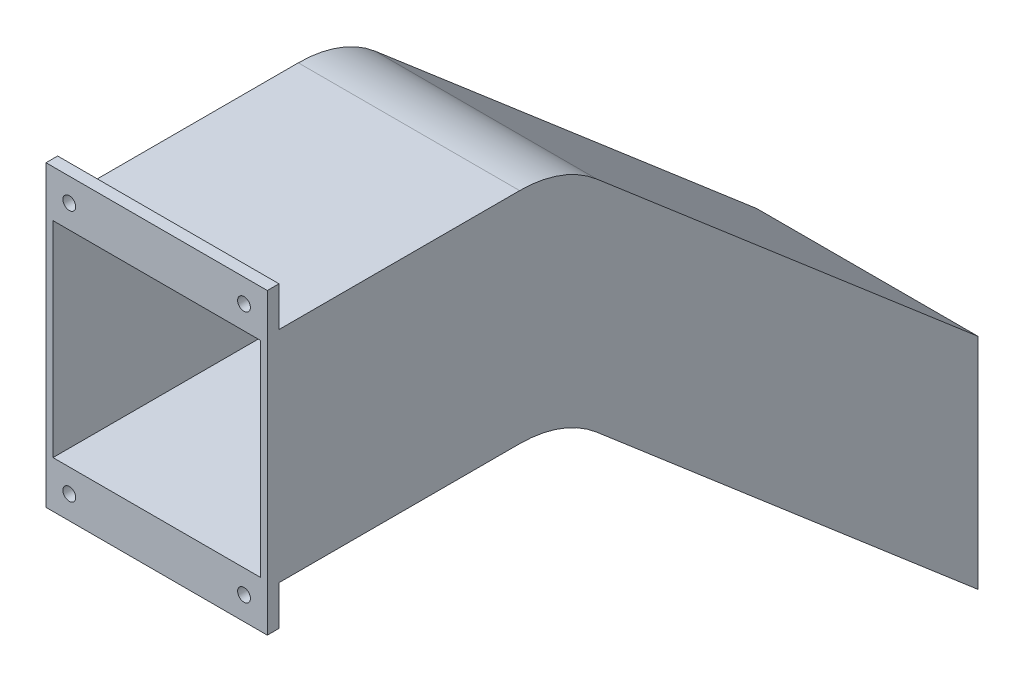
ISO-10303-21;
HEADER;
FILE_DESCRIPTION(('STEP AP214'),'2;1');
FILE_NAME('part.step','',(''),(''),'','','');
FILE_SCHEMA(('AUTOMOTIVE_DESIGN { 1 0 10303 214 1 1 1 1 }'));
ENDSEC;
DATA;
#1=APPLICATION_CONTEXT('core data for automotive mechanical design processes');
#2=APPLICATION_PROTOCOL_DEFINITION('international standard','automotive_design',2000,#1);
#3=PRODUCT_CONTEXT('',#1,'mechanical');
#4=PRODUCT('Part','Part','',(#3));
#5=PRODUCT_RELATED_PRODUCT_CATEGORY('part','',(#4));
#6=PRODUCT_DEFINITION_FORMATION('','',#4);
#7=PRODUCT_DEFINITION_CONTEXT('part definition',#1,'design');
#8=PRODUCT_DEFINITION('design','',#6,#7);
#9=PRODUCT_DEFINITION_SHAPE('','',#8);
#10=(LENGTH_UNIT() NAMED_UNIT(*) SI_UNIT(.MILLI.,.METRE.));
#11=(NAMED_UNIT(*) PLANE_ANGLE_UNIT() SI_UNIT($,.RADIAN.));
#12=(NAMED_UNIT(*) SI_UNIT($,.STERADIAN.) SOLID_ANGLE_UNIT());
#13=UNCERTAINTY_MEASURE_WITH_UNIT(LENGTH_MEASURE(1.E-05),#10,'distance_accuracy_value','');
#14=(GEOMETRIC_REPRESENTATION_CONTEXT(3) GLOBAL_UNCERTAINTY_ASSIGNED_CONTEXT((#13)) GLOBAL_UNIT_ASSIGNED_CONTEXT((#10,
#11,#12)) REPRESENTATION_CONTEXT('',''));
#15=CARTESIAN_POINT('',(0.,0.,0.));
#16=DIRECTION('',(0.,0.,1.));
#17=DIRECTION('',(1.,0.,0.));
#18=AXIS2_PLACEMENT_3D('',#15,#16,#17);
#19=CARTESIAN_POINT('',(-47.4625,47.012499986,127.));
#20=DIRECTION('',(0.,-1.,0.));
#21=DIRECTION('',(0.,0.,-1.));
#22=AXIS2_PLACEMENT_3D('',#19,#20,#21);
#23=PLANE('',#22);
#24=DIRECTION('',(-1.,0.,0.));
#25=VECTOR('',#24,1.);
#26=CARTESIAN_POINT('',(-47.4625,47.012499986,122.));
#27=LINE('',#26,#25);
#28=CARTESIAN_POINT('',(47.4625,47.012499986,122.));
#29=VERTEX_POINT('',#28);
#30=CARTESIAN_POINT('',(-47.4625,47.012499986,122.));
#31=VERTEX_POINT('',#30);
#32=EDGE_CURVE('E213',#29,#31,#27,.T.);
#33=ORIENTED_EDGE('',*,*,#32,.F.);
#34=DIRECTION('',(0.,0.,-1.));
#35=VECTOR('',#34,1.);
#36=CARTESIAN_POINT('',(47.4625,47.012499986,127.));
#37=LINE('',#36,#35);
#38=CARTESIAN_POINT('',(47.4625,47.012499986,18.7921430717464));
#39=VERTEX_POINT('',#38);
#40=EDGE_CURVE('E345',#29,#39,#37,.T.);
#41=ORIENTED_EDGE('',*,*,#40,.T.);
#42=DIRECTION('',(-1.,0.,0.));
#43=VECTOR('',#42,1.);
#44=CARTESIAN_POINT('',(-47.4625,47.012499986,18.7921430717464));
#45=LINE('',#44,#43);
#46=CARTESIAN_POINT('',(-47.4625,47.012499986,18.7921430717464));
#47=VERTEX_POINT('',#46);
#48=EDGE_CURVE('E347',#39,#47,#45,.T.);
#49=ORIENTED_EDGE('',*,*,#48,.T.);
#50=DIRECTION('',(0.,0.,-1.));
#51=VECTOR('',#50,1.);
#52=CARTESIAN_POINT('',(-47.4625,47.012499986,127.));
#53=LINE('',#52,#51);
#54=EDGE_CURVE('E343',#31,#47,#53,.T.);
#55=ORIENTED_EDGE('',*,*,#54,.F.);
#56=EDGE_LOOP('',(#33,#41,#49,#55));
#57=FACE_BOUND('',#56,.T.);
#58=ADVANCED_FACE('F39',(#57),#23,.F.);
#59=CARTESIAN_POINT('',(-47.4625,-47.012499986,127.));
#60=DIRECTION('',(0.,1.,0.));
#61=DIRECTION('',(0.,0.,1.));
#62=AXIS2_PLACEMENT_3D('',#59,#60,#61);
#63=PLANE('',#62);
#64=DIRECTION('',(1.,0.,0.));
#65=VECTOR('',#64,1.);
#66=CARTESIAN_POINT('',(-47.4625,-47.012499986,122.));
#67=LINE('',#66,#65);
#68=CARTESIAN_POINT('',(-47.4625,-47.012499986,122.));
#69=VERTEX_POINT('',#68);
#70=CARTESIAN_POINT('',(47.4625,-47.012499986,122.));
#71=VERTEX_POINT('',#70);
#72=EDGE_CURVE('E227',#69,#71,#67,.T.);
#73=ORIENTED_EDGE('',*,*,#72,.F.);
#74=DIRECTION('',(0.,0.,-1.));
#75=VECTOR('',#74,1.);
#76=CARTESIAN_POINT('',(-47.4625,-47.012499986,127.));
#77=LINE('',#76,#75);
#78=CARTESIAN_POINT('',(-47.4625,-47.012499986,18.7921430717464));
#79=VERTEX_POINT('',#78);
#80=EDGE_CURVE('E340',#69,#79,#77,.T.);
#81=ORIENTED_EDGE('',*,*,#80,.T.);
#82=DIRECTION('',(1.,0.,0.));
#83=VECTOR('',#82,1.);
#84=CARTESIAN_POINT('',(-47.4625,-47.012499986,18.7921430717464));
#85=LINE('',#84,#83);
#86=CARTESIAN_POINT('',(47.4625,-47.012499986,18.7921430717464));
#87=VERTEX_POINT('',#86);
#88=EDGE_CURVE('E357',#79,#87,#85,.T.);
#89=ORIENTED_EDGE('',*,*,#88,.T.);
#90=DIRECTION('',(0.,0.,-1.));
#91=VECTOR('',#90,1.);
#92=CARTESIAN_POINT('',(47.4625,-47.012499986,127.));
#93=LINE('',#92,#91);
#94=EDGE_CURVE('E198',#71,#87,#93,.T.);
#95=ORIENTED_EDGE('',*,*,#94,.F.);
#96=EDGE_LOOP('',(#73,#81,#89,#95));
#97=FACE_BOUND('',#96,.T.);
#98=ADVANCED_FACE('F417',(#97),#63,.F.);
#99=CARTESIAN_POINT('',(0.,0.,127.));
#100=DIRECTION('',(0.,0.,-1.));
#101=DIRECTION('',(-1.,0.,0.));
#102=AXIS2_PLACEMENT_3D('',#99,#100,#101);
#103=PLANE('',#102);
#104=CARTESIAN_POINT('',(37.4625,54.012499864,127.));
#105=DIRECTION('',(0.,0.,-1.));
#106=DIRECTION('',(-1.,0.,0.));
#107=AXIS2_PLACEMENT_3D('',#104,#105,#106);
#108=CIRCLE('',#107,2.75);
#109=CARTESIAN_POINT('',(34.7125,54.012499864,127.));
#110=VERTEX_POINT('',#109);
#111=EDGE_CURVE('E448',#110,#110,#108,.F.);
#112=ORIENTED_EDGE('',*,*,#111,.F.);
#113=EDGE_LOOP('',(#112));
#114=FACE_BOUND('',#113,.T.);
#115=CARTESIAN_POINT('',(-37.4625,-54.012499864,127.));
#116=DIRECTION('',(0.,0.,-1.));
#117=DIRECTION('',(-1.,0.,0.));
#118=AXIS2_PLACEMENT_3D('',#115,#116,#117);
#119=CIRCLE('',#118,2.75);
#120=CARTESIAN_POINT('',(-40.2125,-54.012499864,127.));
#121=VERTEX_POINT('',#120);
#122=EDGE_CURVE('E452',#121,#121,#119,.F.);
#123=ORIENTED_EDGE('',*,*,#122,.F.);
#124=EDGE_LOOP('',(#123));
#125=FACE_BOUND('',#124,.T.);
#126=CARTESIAN_POINT('',(37.4625,-54.012499864,127.));
#127=DIRECTION('',(0.,0.,-1.));
#128=DIRECTION('',(-1.,0.,0.));
#129=AXIS2_PLACEMENT_3D('',#126,#127,#128);
#130=CIRCLE('',#129,2.75);
#131=CARTESIAN_POINT('',(34.7125,-54.012499864,127.));
#132=VERTEX_POINT('',#131);
#133=EDGE_CURVE('E456',#132,#132,#130,.F.);
#134=ORIENTED_EDGE('',*,*,#133,.F.);
#135=EDGE_LOOP('',(#134));
#136=FACE_BOUND('',#135,.T.);
#137=CARTESIAN_POINT('',(-37.4625,54.012499864,127.));
#138=DIRECTION('',(0.,0.,-1.));
#139=DIRECTION('',(-1.,0.,0.));
#140=AXIS2_PLACEMENT_3D('',#137,#138,#139);
#141=CIRCLE('',#140,2.75);
#142=CARTESIAN_POINT('',(-40.2125,54.012499864,127.));
#143=VERTEX_POINT('',#142);
#144=EDGE_CURVE('E216',#143,#143,#141,.F.);
#145=ORIENTED_EDGE('',*,*,#144,.F.);
#146=EDGE_LOOP('',(#145));
#147=FACE_BOUND('',#146,.T.);
#148=DIRECTION('',(0.,1.,0.));
#149=VECTOR('',#148,1.);
#150=CARTESIAN_POINT('',(47.4625,-47.012499986,127.));
#151=LINE('',#150,#149);
#152=CARTESIAN_POINT('',(47.4625,-64.012499864,127.));
#153=VERTEX_POINT('',#152);
#154=CARTESIAN_POINT('',(47.4625,64.012499864,127.));
#155=VERTEX_POINT('',#154);
#156=EDGE_CURVE('E199',#153,#155,#151,.T.);
#157=ORIENTED_EDGE('',*,*,#156,.T.);
#158=DIRECTION('',(1.,0.,0.));
#159=VECTOR('',#158,1.);
#160=CARTESIAN_POINT('',(-47.4625,64.012499864,127.));
#161=LINE('',#160,#159);
#162=CARTESIAN_POINT('',(-47.4625,64.012499864,127.));
#163=VERTEX_POINT('',#162);
#164=EDGE_CURVE('E202',#163,#155,#161,.T.);
#165=ORIENTED_EDGE('',*,*,#164,.F.);
#166=DIRECTION('',(0.,-1.,0.));
#167=VECTOR('',#166,1.);
#168=CARTESIAN_POINT('',(-47.4625,-47.012499986,127.));
#169=LINE('',#168,#167);
#170=CARTESIAN_POINT('',(-47.4625,-64.012499864,127.));
#171=VERTEX_POINT('',#170);
#172=EDGE_CURVE('E187',#163,#171,#169,.T.);
#173=ORIENTED_EDGE('',*,*,#172,.T.);
#174=DIRECTION('',(-1.,0.,0.));
#175=VECTOR('',#174,1.);
#176=CARTESIAN_POINT('',(-47.4625,-64.012499864,127.));
#177=LINE('',#176,#175);
#178=EDGE_CURVE('E236',#153,#171,#177,.T.);
#179=ORIENTED_EDGE('',*,*,#178,.F.);
#180=EDGE_LOOP('',(#157,#165,#173,#179));
#181=FACE_BOUND('',#180,.T.);
#182=DIRECTION('',(0.,1.,0.));
#183=VECTOR('',#182,1.);
#184=CARTESIAN_POINT('',(44.4625,0.,127.));
#185=LINE('',#184,#183);
#186=CARTESIAN_POINT('',(44.4625,-44.012499986,127.));
#187=VERTEX_POINT('',#186);
#188=CARTESIAN_POINT('',(44.4625,44.012499986,127.));
#189=VERTEX_POINT('',#188);
#190=EDGE_CURVE('E287',#187,#189,#185,.T.);
#191=ORIENTED_EDGE('',*,*,#190,.F.);
#192=DIRECTION('',(1.,0.,0.));
#193=VECTOR('',#192,1.);
#194=CARTESIAN_POINT('',(0.,-44.012499986,127.));
#195=LINE('',#194,#193);
#196=CARTESIAN_POINT('',(-44.4625,-44.012499986,127.));
#197=VERTEX_POINT('',#196);
#198=EDGE_CURVE('E266',#197,#187,#195,.T.);
#199=ORIENTED_EDGE('',*,*,#198,.F.);
#200=DIRECTION('',(0.,-1.,0.));
#201=VECTOR('',#200,1.);
#202=CARTESIAN_POINT('',(-44.4625,0.,127.));
#203=LINE('',#202,#201);
#204=CARTESIAN_POINT('',(-44.4625,44.012499986,127.));
#205=VERTEX_POINT('',#204);
#206=EDGE_CURVE('E304',#205,#197,#203,.T.);
#207=ORIENTED_EDGE('',*,*,#206,.F.);
#208=DIRECTION('',(-1.,0.,0.));
#209=VECTOR('',#208,1.);
#210=CARTESIAN_POINT('',(0.,44.012499986,127.));
#211=LINE('',#210,#209);
#212=EDGE_CURVE('E301',#189,#205,#211,.T.);
#213=ORIENTED_EDGE('',*,*,#212,.F.);
#214=EDGE_LOOP('',(#191,#199,#207,#213));
#215=FACE_BOUND('',#214,.T.);
#216=ADVANCED_FACE('F203',(#114,#125,#136,#147,#181,#215),#103,.F.);
#217=CARTESIAN_POINT('',(-351.334381902884,-199.412499986,-177.8));
#218=DIRECTION('',(0.,0.,-1.));
#219=DIRECTION('',(-1.,0.,0.));
#220=AXIS2_PLACEMENT_3D('',#217,#218,#219);
#221=PLANE('',#220);
#222=DIRECTION('',(0.,-1.,0.));
#223=VECTOR('',#222,1.);
#224=CARTESIAN_POINT('',(-47.4625,-199.412499986,-177.8));
#225=LINE('',#224,#223);
#226=CARTESIAN_POINT('',(-47.4625,-105.387500014,-177.8));
#227=VERTEX_POINT('',#226);
#228=CARTESIAN_POINT('',(-47.4625,-199.412499986,-177.8));
#229=VERTEX_POINT('',#228);
#230=EDGE_CURVE('E316',#227,#229,#225,.T.);
#231=ORIENTED_EDGE('',*,*,#230,.F.);
#232=DIRECTION('',(1.,0.,0.));
#233=VECTOR('',#232,1.);
#234=CARTESIAN_POINT('',(-351.334381902884,-105.387500014,-177.8));
#235=LINE('',#234,#233);
#236=CARTESIAN_POINT('',(47.4625,-105.387500014,-177.8));
#237=VERTEX_POINT('',#236);
#238=EDGE_CURVE('E319',#227,#237,#235,.T.);
#239=ORIENTED_EDGE('',*,*,#238,.T.);
#240=DIRECTION('',(0.,1.,0.));
#241=VECTOR('',#240,1.);
#242=CARTESIAN_POINT('',(47.4625,-199.412499986,-177.8));
#243=LINE('',#242,#241);
#244=CARTESIAN_POINT('',(47.4625,-199.412499986,-177.8));
#245=VERTEX_POINT('',#244);
#246=EDGE_CURVE('E324',#245,#237,#243,.T.);
#247=ORIENTED_EDGE('',*,*,#246,.F.);
#248=DIRECTION('',(1.,0.,0.));
#249=VECTOR('',#248,1.);
#250=CARTESIAN_POINT('',(-351.334381902884,-199.412499986,-177.8));
#251=LINE('',#250,#249);
#252=EDGE_CURVE('E330',#229,#245,#251,.T.);
#253=ORIENTED_EDGE('',*,*,#252,.F.);
#254=EDGE_LOOP('',(#231,#239,#247,#253));
#255=FACE_BOUND('',#254,.T.);
#256=DIRECTION('',(1.,0.,0.));
#257=VECTOR('',#256,1.);
#258=CARTESIAN_POINT('',(-351.334381902884,-109.33873335284,-177.8));
#259=LINE('',#258,#257);
#260=CARTESIAN_POINT('',(-44.4625,-109.33873335284,-177.8));
#261=VERTEX_POINT('',#260);
#262=CARTESIAN_POINT('',(44.4625,-109.33873335284,-177.8));
#263=VERTEX_POINT('',#262);
#264=EDGE_CURVE('E312',#261,#263,#259,.T.);
#265=ORIENTED_EDGE('',*,*,#264,.F.);
#266=DIRECTION('',(0.,-1.,0.));
#267=VECTOR('',#266,1.);
#268=CARTESIAN_POINT('',(-44.4625,-199.412499986,-177.8));
#269=LINE('',#268,#267);
#270=CARTESIAN_POINT('',(-44.4625,-195.46126664716,-177.8));
#271=VERTEX_POINT('',#270);
#272=EDGE_CURVE('E284',#261,#271,#269,.T.);
#273=ORIENTED_EDGE('',*,*,#272,.T.);
#274=DIRECTION('',(1.,0.,0.));
#275=VECTOR('',#274,1.);
#276=CARTESIAN_POINT('',(-351.334381902884,-195.46126664716,-177.8));
#277=LINE('',#276,#275);
#278=CARTESIAN_POINT('',(44.4625,-195.46126664716,-177.8));
#279=VERTEX_POINT('',#278);
#280=EDGE_CURVE('E251',#271,#279,#277,.T.);
#281=ORIENTED_EDGE('',*,*,#280,.T.);
#282=DIRECTION('',(0.,1.,0.));
#283=VECTOR('',#282,1.);
#284=CARTESIAN_POINT('',(44.4625,-199.412499986,-177.8));
#285=LINE('',#284,#283);
#286=EDGE_CURVE('E252',#279,#263,#285,.T.);
#287=ORIENTED_EDGE('',*,*,#286,.T.);
#288=EDGE_LOOP('',(#265,#273,#281,#287));
#289=FACE_BOUND('',#288,.T.);
#290=ADVANCED_FACE('F383',(#255,#289),#221,.T.);
#291=CARTESIAN_POINT('',(47.4625,-47.012499986,127.));
#292=DIRECTION('',(-1.,0.,0.));
#293=DIRECTION('',(0.,0.,1.));
#294=AXIS2_PLACEMENT_3D('',#291,#292,#293);
#295=PLANE('',#294);
#296=DIRECTION('',(0.,0.650791373455968,0.759256602365297));
#297=VECTOR('',#296,1.);
#298=CARTESIAN_POINT('',(47.4625,-105.387500014,-177.8));
#299=LINE('',#298,#297);
#300=CARTESIAN_POINT('',(47.4625,34.782735386157,-14.2680586998168));
#301=VERTEX_POINT('',#300);
#302=EDGE_CURVE('E327',#237,#301,#299,.T.);
#303=ORIENTED_EDGE('',*,*,#302,.T.);
#304=CARTESIAN_POINT('',(47.4625,-3.787500014,18.7921430717464));
#305=DIRECTION('',(-1.,0.,0.));
#306=DIRECTION('',(0.,0.,1.));
#307=AXIS2_PLACEMENT_3D('',#304,#305,#306);
#308=CIRCLE('',#307,50.8);
#309=EDGE_CURVE('E354',#301,#39,#308,.F.);
#310=ORIENTED_EDGE('',*,*,#309,.T.);
#311=ORIENTED_EDGE('',*,*,#40,.F.);
#312=DIRECTION('',(0.,-1.,0.));
#313=VECTOR('',#312,1.);
#314=CARTESIAN_POINT('',(47.4625,64.012499864,122.));
#315=LINE('',#314,#313);
#316=CARTESIAN_POINT('',(47.4625,64.012499864,122.));
#317=VERTEX_POINT('',#316);
#318=EDGE_CURVE('E225',#317,#29,#315,.T.);
#319=ORIENTED_EDGE('',*,*,#318,.F.);
#320=DIRECTION('',(0.,0.,-1.));
#321=VECTOR('',#320,1.);
#322=CARTESIAN_POINT('',(47.4625,64.012499864,127.));
#323=LINE('',#322,#321);
#324=EDGE_CURVE('E208',#155,#317,#323,.T.);
#325=ORIENTED_EDGE('',*,*,#324,.F.);
#326=ORIENTED_EDGE('',*,*,#156,.F.);
#327=DIRECTION('',(0.,0.,1.));
#328=VECTOR('',#327,1.);
#329=CARTESIAN_POINT('',(47.4625,-64.012499864,127.));
#330=LINE('',#329,#328);
#331=CARTESIAN_POINT('',(47.4625,-64.012499864,122.));
#332=VERTEX_POINT('',#331);
#333=EDGE_CURVE('E232',#332,#153,#330,.T.);
#334=ORIENTED_EDGE('',*,*,#333,.F.);
#335=DIRECTION('',(0.,1.,0.));
#336=VECTOR('',#335,1.);
#337=CARTESIAN_POINT('',(47.4625,-64.012499864,122.));
#338=LINE('',#337,#336);
#339=EDGE_CURVE('E239',#332,#71,#338,.T.);
#340=ORIENTED_EDGE('',*,*,#339,.T.);
#341=ORIENTED_EDGE('',*,*,#94,.T.);
#342=CARTESIAN_POINT('',(47.4625,-97.812499986,18.7921430717464));
#343=DIRECTION('',(-1.,0.,0.));
#344=DIRECTION('',(0.,0.,1.));
#345=AXIS2_PLACEMENT_3D('',#342,#343,#344);
#346=CIRCLE('',#345,50.8);
#347=CARTESIAN_POINT('',(47.4625,-59.2422645858429,-14.2680586998168));
#348=VERTEX_POINT('',#347);
#349=EDGE_CURVE('E48',#87,#348,#346,.T.);
#350=ORIENTED_EDGE('',*,*,#349,.T.);
#351=DIRECTION('',(0.,-0.650791373455969,-0.759256602365297));
#352=VECTOR('',#351,1.);
#353=CARTESIAN_POINT('',(47.4625,-47.012499986,0.));
#354=LINE('',#353,#352);
#355=EDGE_CURVE('E290',#348,#245,#354,.T.);
#356=ORIENTED_EDGE('',*,*,#355,.T.);
#357=ORIENTED_EDGE('',*,*,#246,.T.);
#358=EDGE_LOOP('',(#303,#310,#311,#319,#325,#326,#334,#340,#341,#350,#356,#357));
#359=FACE_BOUND('',#358,.T.);
#360=ADVANCED_FACE('F367',(#359),#295,.F.);
#361=CARTESIAN_POINT('',(-47.4625,-47.012499986,127.));
#362=DIRECTION('',(1.,0.,0.));
#363=DIRECTION('',(0.,0.,-1.));
#364=AXIS2_PLACEMENT_3D('',#361,#362,#363);
#365=PLANE('',#364);
#366=ORIENTED_EDGE('',*,*,#172,.F.);
#367=DIRECTION('',(0.,0.,1.));
#368=VECTOR('',#367,1.);
#369=CARTESIAN_POINT('',(-47.4625,64.012499864,127.));
#370=LINE('',#369,#368);
#371=CARTESIAN_POINT('',(-47.4625,64.012499864,122.));
#372=VERTEX_POINT('',#371);
#373=EDGE_CURVE('E191',#372,#163,#370,.T.);
#374=ORIENTED_EDGE('',*,*,#373,.F.);
#375=DIRECTION('',(0.,-1.,0.));
#376=VECTOR('',#375,1.);
#377=CARTESIAN_POINT('',(-47.4625,64.012499864,122.));
#378=LINE('',#377,#376);
#379=EDGE_CURVE('E55',#372,#31,#378,.T.);
#380=ORIENTED_EDGE('',*,*,#379,.T.);
#381=ORIENTED_EDGE('',*,*,#54,.T.);
#382=CARTESIAN_POINT('',(-47.4625,-3.787500014,18.7921430717464));
#383=DIRECTION('',(1.,0.,0.));
#384=DIRECTION('',(0.,0.,-1.));
#385=AXIS2_PLACEMENT_3D('',#382,#383,#384);
#386=CIRCLE('',#385,50.8);
#387=CARTESIAN_POINT('',(-47.4625,34.7827353861571,-14.2680586998168));
#388=VERTEX_POINT('',#387);
#389=EDGE_CURVE('E350',#47,#388,#386,.F.);
#390=ORIENTED_EDGE('',*,*,#389,.T.);
#391=DIRECTION('',(0.,-0.650791373455968,-0.759256602365297));
#392=VECTOR('',#391,1.);
#393=CARTESIAN_POINT('',(-47.4625,-105.387500014,-177.8));
#394=LINE('',#393,#392);
#395=EDGE_CURVE('E318',#388,#227,#394,.T.);
#396=ORIENTED_EDGE('',*,*,#395,.T.);
#397=ORIENTED_EDGE('',*,*,#230,.T.);
#398=DIRECTION('',(0.,0.650791373455968,0.759256602365297));
#399=VECTOR('',#398,1.);
#400=CARTESIAN_POINT('',(-47.4625,-47.012499986,0.));
#401=LINE('',#400,#399);
#402=CARTESIAN_POINT('',(-47.4625,-59.2422645858429,-14.2680586998168));
#403=VERTEX_POINT('',#402);
#404=EDGE_CURVE('E321',#229,#403,#401,.T.);
#405=ORIENTED_EDGE('',*,*,#404,.T.);
#406=CARTESIAN_POINT('',(-47.4625,-97.812499986,18.7921430717464));
#407=DIRECTION('',(1.,0.,0.));
#408=DIRECTION('',(0.,0.,-1.));
#409=AXIS2_PLACEMENT_3D('',#406,#407,#408);
#410=CIRCLE('',#409,50.8);
#411=EDGE_CURVE('E11',#403,#79,#410,.T.);
#412=ORIENTED_EDGE('',*,*,#411,.T.);
#413=ORIENTED_EDGE('',*,*,#80,.F.);
#414=DIRECTION('',(0.,1.,0.));
#415=VECTOR('',#414,1.);
#416=CARTESIAN_POINT('',(-47.4625,-64.012499864,122.));
#417=LINE('',#416,#415);
#418=CARTESIAN_POINT('',(-47.4625,-64.012499864,122.));
#419=VERTEX_POINT('',#418);
#420=EDGE_CURVE('E245',#419,#69,#417,.T.);
#421=ORIENTED_EDGE('',*,*,#420,.F.);
#422=DIRECTION('',(0.,0.,-1.));
#423=VECTOR('',#422,1.);
#424=CARTESIAN_POINT('',(-47.4625,-64.012499864,127.));
#425=LINE('',#424,#423);
#426=EDGE_CURVE('E194',#171,#419,#425,.T.);
#427=ORIENTED_EDGE('',*,*,#426,.F.);
#428=EDGE_LOOP('',(#366,#374,#380,#381,#390,#396,#397,#405,#412,#413,#421,#427));
#429=FACE_BOUND('',#428,.T.);
#430=ADVANCED_FACE('F189',(#429),#365,.F.);
#431=CARTESIAN_POINT('',(-351.334381902884,-105.387500014,-177.8));
#432=DIRECTION('',(0.,0.759256602365297,-0.650791373455968));
#433=DIRECTION('',(0.,0.650791373455968,0.759256602365297));
#434=AXIS2_PLACEMENT_3D('',#431,#432,#433);
#435=PLANE('',#434);
#436=ORIENTED_EDGE('',*,*,#395,.F.);
#437=DIRECTION('',(-1.,0.,0.));
#438=VECTOR('',#437,1.);
#439=CARTESIAN_POINT('',(47.4625,34.7827353861571,-14.2680586998168));
#440=LINE('',#439,#438);
#441=EDGE_CURVE('E352',#388,#301,#440,.F.);
#442=ORIENTED_EDGE('',*,*,#441,.T.);
#443=ORIENTED_EDGE('',*,*,#302,.F.);
#444=ORIENTED_EDGE('',*,*,#238,.F.);
#445=EDGE_LOOP('',(#436,#442,#443,#444));
#446=FACE_BOUND('',#445,.T.);
#447=ADVANCED_FACE('F388',(#446),#435,.T.);
#448=CARTESIAN_POINT('',(-351.334381902884,-47.012499986,0.));
#449=DIRECTION('',(0.,-0.759256602365297,0.650791373455968));
#450=DIRECTION('',(0.,-0.650791373455968,-0.759256602365297));
#451=AXIS2_PLACEMENT_3D('',#448,#449,#450);
#452=PLANE('',#451);
#453=ORIENTED_EDGE('',*,*,#355,.F.);
#454=DIRECTION('',(1.,0.,0.));
#455=VECTOR('',#454,1.);
#456=CARTESIAN_POINT('',(-351.334381902884,-59.2422645858429,-14.2680586998168));
#457=LINE('',#456,#455);
#458=EDGE_CURVE('E361',#348,#403,#457,.F.);
#459=ORIENTED_EDGE('',*,*,#458,.T.);
#460=ORIENTED_EDGE('',*,*,#404,.F.);
#461=ORIENTED_EDGE('',*,*,#252,.T.);
#462=EDGE_LOOP('',(#453,#459,#460,#461));
#463=FACE_BOUND('',#462,.T.);
#464=ADVANCED_FACE('F373',(#463),#452,.T.);
#465=CARTESIAN_POINT('',(-47.4625,-3.787500014,18.7921430717464));
#466=DIRECTION('',(1.,0.,0.));
#467=DIRECTION('',(0.,0.,-1.));
#468=AXIS2_PLACEMENT_3D('',#465,#466,#467);
#469=CYLINDRICAL_SURFACE('',#468,50.8);
#470=ORIENTED_EDGE('',*,*,#309,.F.);
#471=ORIENTED_EDGE('',*,*,#441,.F.);
#472=ORIENTED_EDGE('',*,*,#389,.F.);
#473=ORIENTED_EDGE('',*,*,#48,.F.);
#474=EDGE_LOOP('',(#470,#471,#472,#473));
#475=FACE_BOUND('',#474,.T.);
#476=ADVANCED_FACE('F392',(#475),#469,.T.);
#477=CARTESIAN_POINT('',(-47.4625,-97.812499986,18.7921430717464));
#478=DIRECTION('',(1.,0.,0.));
#479=DIRECTION('',(0.,0.,-1.));
#480=AXIS2_PLACEMENT_3D('',#477,#478,#479);
#481=CYLINDRICAL_SURFACE('',#480,50.8);
#482=ORIENTED_EDGE('',*,*,#411,.F.);
#483=ORIENTED_EDGE('',*,*,#458,.F.);
#484=ORIENTED_EDGE('',*,*,#349,.F.);
#485=ORIENTED_EDGE('',*,*,#88,.F.);
#486=EDGE_LOOP('',(#482,#483,#484,#485));
#487=FACE_BOUND('',#486,.T.);
#488=ADVANCED_FACE('F41',(#487),#481,.F.);
#489=CARTESIAN_POINT('',(44.4625,-47.012499986,127.));
#490=DIRECTION('',(-1.,0.,0.));
#491=DIRECTION('',(0.,0.,1.));
#492=AXIS2_PLACEMENT_3D('',#489,#490,#491);
#493=PLANE('',#492);
#494=DIRECTION('',(0.,0.650791373455968,0.759256602365297));
#495=VECTOR('',#494,1.);
#496=CARTESIAN_POINT('',(44.4625,-107.665269821096,-175.847625879632));
#497=LINE('',#496,#495);
#498=CARTESIAN_POINT('',(44.4625,32.5049655790612,-12.3156845794488));
#499=VERTEX_POINT('',#498);
#500=EDGE_CURVE('E248',#263,#499,#497,.T.);
#501=ORIENTED_EDGE('',*,*,#500,.F.);
#502=ORIENTED_EDGE('',*,*,#286,.F.);
#503=DIRECTION('',(0.,-0.650791373455968,-0.759256602365297));
#504=VECTOR('',#503,1.);
#505=CARTESIAN_POINT('',(44.4625,-44.7347301789041,-1.95237412036791));
#506=LINE('',#505,#504);
#507=CARTESIAN_POINT('',(44.4625,-56.9644947787471,-16.2204328201847));
#508=VERTEX_POINT('',#507);
#509=EDGE_CURVE('E247',#508,#279,#506,.T.);
#510=ORIENTED_EDGE('',*,*,#509,.F.);
#511=CARTESIAN_POINT('',(44.4625,-97.812499986,18.7921430717464));
#512=DIRECTION('',(-1.,0.,0.));
#513=DIRECTION('',(0.,0.,1.));
#514=AXIS2_PLACEMENT_3D('',#511,#512,#513);
#515=CIRCLE('',#514,53.8);
#516=CARTESIAN_POINT('',(44.4625,-44.012499986,18.7921430717464));
#517=VERTEX_POINT('',#516);
#518=EDGE_CURVE('E267',#517,#508,#515,.T.);
#519=ORIENTED_EDGE('',*,*,#518,.F.);
#520=DIRECTION('',(0.,0.,-1.));
#521=VECTOR('',#520,1.);
#522=CARTESIAN_POINT('',(44.4625,-44.012499986,127.));
#523=LINE('',#522,#521);
#524=EDGE_CURVE('E262',#187,#517,#523,.T.);
#525=ORIENTED_EDGE('',*,*,#524,.F.);
#526=ORIENTED_EDGE('',*,*,#190,.T.);
#527=DIRECTION('',(0.,0.,-1.));
#528=VECTOR('',#527,1.);
#529=CARTESIAN_POINT('',(44.4625,44.012499986,127.));
#530=LINE('',#529,#528);
#531=CARTESIAN_POINT('',(44.4625,44.012499986,18.7921430717464));
#532=VERTEX_POINT('',#531);
#533=EDGE_CURVE('E257',#189,#532,#530,.T.);
#534=ORIENTED_EDGE('',*,*,#533,.T.);
#535=CARTESIAN_POINT('',(44.4625,-3.787500014,18.7921430717464));
#536=DIRECTION('',(-1.,0.,0.));
#537=DIRECTION('',(0.,0.,1.));
#538=AXIS2_PLACEMENT_3D('',#535,#536,#537);
#539=CIRCLE('',#538,47.8);
#540=EDGE_CURVE('E253',#499,#532,#539,.F.);
#541=ORIENTED_EDGE('',*,*,#540,.F.);
#542=EDGE_LOOP('',(#501,#502,#510,#519,#525,#526,#534,#541));
#543=FACE_BOUND('',#542,.T.);
#544=ADVANCED_FACE('F432',(#543),#493,.T.);
#545=CARTESIAN_POINT('',(-47.4625,44.012499986,127.));
#546=DIRECTION('',(0.,-1.,0.));
#547=DIRECTION('',(0.,0.,-1.));
#548=AXIS2_PLACEMENT_3D('',#545,#546,#547);
#549=PLANE('',#548);
#550=ORIENTED_EDGE('',*,*,#533,.F.);
#551=ORIENTED_EDGE('',*,*,#212,.T.);
#552=DIRECTION('',(0.,0.,-1.));
#553=VECTOR('',#552,1.);
#554=CARTESIAN_POINT('',(-44.4625,44.012499986,127.));
#555=LINE('',#554,#553);
#556=CARTESIAN_POINT('',(-44.4625,44.012499986,18.7921430717464));
#557=VERTEX_POINT('',#556);
#558=EDGE_CURVE('E261',#205,#557,#555,.T.);
#559=ORIENTED_EDGE('',*,*,#558,.T.);
#560=DIRECTION('',(1.,0.,0.));
#561=VECTOR('',#560,1.);
#562=CARTESIAN_POINT('',(-47.4625,44.012499986,18.7921430717464));
#563=LINE('',#562,#561);
#564=EDGE_CURVE('E260',#532,#557,#563,.F.);
#565=ORIENTED_EDGE('',*,*,#564,.F.);
#566=EDGE_LOOP('',(#550,#551,#559,#565));
#567=FACE_BOUND('',#566,.T.);
#568=ADVANCED_FACE('F503',(#567),#549,.T.);
#569=CARTESIAN_POINT('',(-44.4625,-47.012499986,127.));
#570=DIRECTION('',(1.,0.,0.));
#571=DIRECTION('',(0.,0.,-1.));
#572=AXIS2_PLACEMENT_3D('',#569,#570,#571);
#573=PLANE('',#572);
#574=ORIENTED_EDGE('',*,*,#558,.F.);
#575=ORIENTED_EDGE('',*,*,#206,.T.);
#576=DIRECTION('',(0.,0.,-1.));
#577=VECTOR('',#576,1.);
#578=CARTESIAN_POINT('',(-44.4625,-44.012499986,127.));
#579=LINE('',#578,#577);
#580=CARTESIAN_POINT('',(-44.4625,-44.012499986,18.7921430717464));
#581=VERTEX_POINT('',#580);
#582=EDGE_CURVE('E63',#197,#581,#579,.T.);
#583=ORIENTED_EDGE('',*,*,#582,.T.);
#584=CARTESIAN_POINT('',(-44.4625,-97.812499986,18.7921430717464));
#585=DIRECTION('',(1.,0.,0.));
#586=DIRECTION('',(0.,0.,-1.));
#587=AXIS2_PLACEMENT_3D('',#584,#585,#586);
#588=CIRCLE('',#587,53.8);
#589=CARTESIAN_POINT('',(-44.4625,-56.9644947787471,-16.2204328201847));
#590=VERTEX_POINT('',#589);
#591=EDGE_CURVE('E270',#590,#581,#588,.T.);
#592=ORIENTED_EDGE('',*,*,#591,.F.);
#593=DIRECTION('',(0.,0.650791373455968,0.759256602365297));
#594=VECTOR('',#593,1.);
#595=CARTESIAN_POINT('',(-44.4625,-44.7347301789041,-1.95237412036791));
#596=LINE('',#595,#594);
#597=EDGE_CURVE('E283',#271,#590,#596,.T.);
#598=ORIENTED_EDGE('',*,*,#597,.F.);
#599=ORIENTED_EDGE('',*,*,#272,.F.);
#600=DIRECTION('',(0.,-0.650791373455968,-0.759256602365297));
#601=VECTOR('',#600,1.);
#602=CARTESIAN_POINT('',(-44.4625,-107.665269821096,-175.847625879632));
#603=LINE('',#602,#601);
#604=CARTESIAN_POINT('',(-44.4625,32.5049655790612,-12.3156845794488));
#605=VERTEX_POINT('',#604);
#606=EDGE_CURVE('E281',#605,#261,#603,.T.);
#607=ORIENTED_EDGE('',*,*,#606,.F.);
#608=CARTESIAN_POINT('',(-44.4625,-3.787500014,18.7921430717464));
#609=DIRECTION('',(1.,0.,0.));
#610=DIRECTION('',(0.,0.,-1.));
#611=AXIS2_PLACEMENT_3D('',#608,#609,#610);
#612=CIRCLE('',#611,47.8);
#613=EDGE_CURVE('E277',#557,#605,#612,.F.);
#614=ORIENTED_EDGE('',*,*,#613,.F.);
#615=EDGE_LOOP('',(#574,#575,#583,#592,#598,#599,#607,#614));
#616=FACE_BOUND('',#615,.T.);
#617=ADVANCED_FACE('F507',(#616),#573,.T.);
#618=CARTESIAN_POINT('',(-47.4625,-44.012499986,127.));
#619=DIRECTION('',(0.,1.,0.));
#620=DIRECTION('',(0.,0.,1.));
#621=AXIS2_PLACEMENT_3D('',#618,#619,#620);
#622=PLANE('',#621);
#623=ORIENTED_EDGE('',*,*,#582,.F.);
#624=ORIENTED_EDGE('',*,*,#198,.T.);
#625=ORIENTED_EDGE('',*,*,#524,.T.);
#626=DIRECTION('',(1.,0.,0.));
#627=VECTOR('',#626,1.);
#628=CARTESIAN_POINT('',(-47.4625,-44.012499986,18.7921430717464));
#629=LINE('',#628,#627);
#630=EDGE_CURVE('E255',#581,#517,#629,.T.);
#631=ORIENTED_EDGE('',*,*,#630,.F.);
#632=EDGE_LOOP('',(#623,#624,#625,#631));
#633=FACE_BOUND('',#632,.T.);
#634=ADVANCED_FACE('F511',(#633),#622,.T.);
#635=CARTESIAN_POINT('',(-351.334381902884,-107.665269821096,-175.847625879632));
#636=DIRECTION('',(0.,0.759256602365297,-0.650791373455968));
#637=DIRECTION('',(0.,0.650791373455968,0.759256602365297));
#638=AXIS2_PLACEMENT_3D('',#635,#636,#637);
#639=PLANE('',#638);
#640=ORIENTED_EDGE('',*,*,#606,.T.);
#641=ORIENTED_EDGE('',*,*,#264,.T.);
#642=ORIENTED_EDGE('',*,*,#500,.T.);
#643=DIRECTION('',(1.,0.,0.));
#644=VECTOR('',#643,1.);
#645=CARTESIAN_POINT('',(-351.334381902884,32.5049655790612,-12.3156845794488));
#646=LINE('',#645,#644);
#647=EDGE_CURVE('E256',#605,#499,#646,.T.);
#648=ORIENTED_EDGE('',*,*,#647,.F.);
#649=EDGE_LOOP('',(#640,#641,#642,#648));
#650=FACE_BOUND('',#649,.T.);
#651=ADVANCED_FACE('F515',(#650),#639,.F.);
#652=CARTESIAN_POINT('',(-351.334381902884,-44.7347301789041,-1.95237412036791));
#653=DIRECTION('',(0.,-0.759256602365297,0.650791373455968));
#654=DIRECTION('',(0.,-0.650791373455968,-0.759256602365297));
#655=AXIS2_PLACEMENT_3D('',#652,#653,#654);
#656=PLANE('',#655);
#657=ORIENTED_EDGE('',*,*,#509,.T.);
#658=ORIENTED_EDGE('',*,*,#280,.F.);
#659=ORIENTED_EDGE('',*,*,#597,.T.);
#660=DIRECTION('',(1.,0.,0.));
#661=VECTOR('',#660,1.);
#662=CARTESIAN_POINT('',(-351.334381902884,-56.9644947787471,-16.2204328201847));
#663=LINE('',#662,#661);
#664=EDGE_CURVE('E271',#508,#590,#663,.F.);
#665=ORIENTED_EDGE('',*,*,#664,.F.);
#666=EDGE_LOOP('',(#657,#658,#659,#665));
#667=FACE_BOUND('',#666,.T.);
#668=ADVANCED_FACE('F518',(#667),#656,.F.);
#669=CARTESIAN_POINT('',(-47.4625,-3.787500014,18.7921430717464));
#670=DIRECTION('',(1.,0.,0.));
#671=DIRECTION('',(0.,0.,-1.));
#672=AXIS2_PLACEMENT_3D('',#669,#670,#671);
#673=CYLINDRICAL_SURFACE('',#672,47.8);
#674=ORIENTED_EDGE('',*,*,#540,.T.);
#675=ORIENTED_EDGE('',*,*,#564,.T.);
#676=ORIENTED_EDGE('',*,*,#613,.T.);
#677=ORIENTED_EDGE('',*,*,#647,.T.);
#678=EDGE_LOOP('',(#674,#675,#676,#677));
#679=FACE_BOUND('',#678,.T.);
#680=ADVANCED_FACE('F496',(#679),#673,.F.);
#681=CARTESIAN_POINT('',(-47.4625,-97.812499986,18.7921430717464));
#682=DIRECTION('',(1.,0.,0.));
#683=DIRECTION('',(0.,0.,-1.));
#684=AXIS2_PLACEMENT_3D('',#681,#682,#683);
#685=CYLINDRICAL_SURFACE('',#684,53.8);
#686=ORIENTED_EDGE('',*,*,#591,.T.);
#687=ORIENTED_EDGE('',*,*,#630,.T.);
#688=ORIENTED_EDGE('',*,*,#518,.T.);
#689=ORIENTED_EDGE('',*,*,#664,.T.);
#690=EDGE_LOOP('',(#686,#687,#688,#689));
#691=FACE_BOUND('',#690,.T.);
#692=ADVANCED_FACE('F487',(#691),#685,.T.);
#693=CARTESIAN_POINT('',(-47.4625,-64.012499864,122.));
#694=DIRECTION('',(0.,0.,1.));
#695=DIRECTION('',(1.,0.,0.));
#696=AXIS2_PLACEMENT_3D('',#693,#694,#695);
#697=PLANE('',#696);
#698=CARTESIAN_POINT('',(-37.4625,-54.012499864,122.));
#699=DIRECTION('',(0.,0.,-1.));
#700=DIRECTION('',(1.,0.,0.));
#701=AXIS2_PLACEMENT_3D('',#698,#699,#700);
#702=CIRCLE('',#701,2.75);
#703=CARTESIAN_POINT('',(-34.7125,-54.012499864,122.));
#704=VERTEX_POINT('',#703);
#705=EDGE_CURVE('E470',#704,#704,#702,.T.);
#706=ORIENTED_EDGE('',*,*,#705,.F.);
#707=EDGE_LOOP('',(#706));
#708=FACE_BOUND('',#707,.T.);
#709=CARTESIAN_POINT('',(37.4625,-54.012499864,122.));
#710=DIRECTION('',(0.,0.,-1.));
#711=DIRECTION('',(-1.,0.,0.));
#712=AXIS2_PLACEMENT_3D('',#709,#710,#711);
#713=CIRCLE('',#712,2.75);
#714=CARTESIAN_POINT('',(34.7125,-54.012499864,122.));
#715=VERTEX_POINT('',#714);
#716=EDGE_CURVE('E477',#715,#715,#713,.T.);
#717=ORIENTED_EDGE('',*,*,#716,.F.);
#718=EDGE_LOOP('',(#717));
#719=FACE_BOUND('',#718,.T.);
#720=ORIENTED_EDGE('',*,*,#72,.T.);
#721=ORIENTED_EDGE('',*,*,#339,.F.);
#722=DIRECTION('',(1.,0.,0.));
#723=VECTOR('',#722,1.);
#724=CARTESIAN_POINT('',(-47.4625,-64.012499864,122.));
#725=LINE('',#724,#723);
#726=EDGE_CURVE('E229',#419,#332,#725,.T.);
#727=ORIENTED_EDGE('',*,*,#726,.F.);
#728=ORIENTED_EDGE('',*,*,#420,.T.);
#729=EDGE_LOOP('',(#720,#721,#727,#728));
#730=FACE_BOUND('',#729,.T.);
#731=ADVANCED_FACE('F411',(#708,#719,#730),#697,.F.);
#732=CARTESIAN_POINT('',(0.,-64.012499864,0.));
#733=DIRECTION('',(0.,-1.,0.));
#734=DIRECTION('',(0.,0.,-1.));
#735=AXIS2_PLACEMENT_3D('',#732,#733,#734);
#736=PLANE('',#735);
#737=ORIENTED_EDGE('',*,*,#426,.T.);
#738=ORIENTED_EDGE('',*,*,#726,.T.);
#739=ORIENTED_EDGE('',*,*,#333,.T.);
#740=ORIENTED_EDGE('',*,*,#178,.T.);
#741=EDGE_LOOP('',(#737,#738,#739,#740));
#742=FACE_BOUND('',#741,.T.);
#743=ADVANCED_FACE('F402',(#742),#736,.T.);
#744=CARTESIAN_POINT('',(-47.4625,64.012499864,122.));
#745=DIRECTION('',(0.,0.,1.));
#746=DIRECTION('',(1.,0.,0.));
#747=AXIS2_PLACEMENT_3D('',#744,#745,#746);
#748=PLANE('',#747);
#749=CARTESIAN_POINT('',(37.4625,54.012499864,122.));
#750=DIRECTION('',(0.,0.,-1.));
#751=DIRECTION('',(1.,0.,0.));
#752=AXIS2_PLACEMENT_3D('',#749,#750,#751);
#753=CIRCLE('',#752,2.75);
#754=CARTESIAN_POINT('',(40.2125,54.012499864,122.));
#755=VERTEX_POINT('',#754);
#756=EDGE_CURVE('E466',#755,#755,#753,.T.);
#757=ORIENTED_EDGE('',*,*,#756,.F.);
#758=EDGE_LOOP('',(#757));
#759=FACE_BOUND('',#758,.T.);
#760=CARTESIAN_POINT('',(-37.4625,54.012499864,122.));
#761=DIRECTION('',(0.,0.,-1.));
#762=DIRECTION('',(-1.,0.,0.));
#763=AXIS2_PLACEMENT_3D('',#760,#761,#762);
#764=CIRCLE('',#763,2.75);
#765=CARTESIAN_POINT('',(-40.2125,54.012499864,122.));
#766=VERTEX_POINT('',#765);
#767=EDGE_CURVE('E461',#766,#766,#764,.T.);
#768=ORIENTED_EDGE('',*,*,#767,.F.);
#769=EDGE_LOOP('',(#768));
#770=FACE_BOUND('',#769,.T.);
#771=ORIENTED_EDGE('',*,*,#32,.T.);
#772=ORIENTED_EDGE('',*,*,#379,.F.);
#773=DIRECTION('',(-1.,0.,0.));
#774=VECTOR('',#773,1.);
#775=CARTESIAN_POINT('',(-47.4625,64.012499864,122.));
#776=LINE('',#775,#774);
#777=EDGE_CURVE('E212',#317,#372,#776,.T.);
#778=ORIENTED_EDGE('',*,*,#777,.F.);
#779=ORIENTED_EDGE('',*,*,#318,.T.);
#780=EDGE_LOOP('',(#771,#772,#778,#779));
#781=FACE_BOUND('',#780,.T.);
#782=ADVANCED_FACE('F400',(#759,#770,#781),#748,.F.);
#783=CARTESIAN_POINT('',(0.,64.012499864,0.));
#784=DIRECTION('',(0.,-1.,0.));
#785=DIRECTION('',(0.,0.,-1.));
#786=AXIS2_PLACEMENT_3D('',#783,#784,#785);
#787=PLANE('',#786);
#788=ORIENTED_EDGE('',*,*,#373,.T.);
#789=ORIENTED_EDGE('',*,*,#164,.T.);
#790=ORIENTED_EDGE('',*,*,#324,.T.);
#791=ORIENTED_EDGE('',*,*,#777,.T.);
#792=EDGE_LOOP('',(#788,#789,#790,#791));
#793=FACE_BOUND('',#792,.T.);
#794=ADVANCED_FACE('F210',(#793),#787,.F.);
#795=CARTESIAN_POINT('',(-37.4625,54.012499864,127.001));
#796=DIRECTION('',(0.,0.,-1.));
#797=DIRECTION('',(-1.,0.,0.));
#798=AXIS2_PLACEMENT_3D('',#795,#796,#797);
#799=CYLINDRICAL_SURFACE('',#798,2.75);
#800=ORIENTED_EDGE('',*,*,#767,.T.);
#801=EDGE_LOOP('',(#800));
#802=FACE_BOUND('',#801,.T.);
#803=ORIENTED_EDGE('',*,*,#144,.T.);
#804=EDGE_LOOP('',(#803));
#805=FACE_BOUND('',#804,.T.);
#806=ADVANCED_FACE('F409',(#802,#805),#799,.F.);
#807=CARTESIAN_POINT('',(37.4625,54.012499864,127.001));
#808=DIRECTION('',(0.,0.,-1.));
#809=DIRECTION('',(-1.,0.,0.));
#810=AXIS2_PLACEMENT_3D('',#807,#808,#809);
#811=CYLINDRICAL_SURFACE('',#810,2.75);
#812=ORIENTED_EDGE('',*,*,#756,.T.);
#813=EDGE_LOOP('',(#812));
#814=FACE_BOUND('',#813,.T.);
#815=ORIENTED_EDGE('',*,*,#111,.T.);
#816=EDGE_LOOP('',(#815));
#817=FACE_BOUND('',#816,.T.);
#818=ADVANCED_FACE('F613',(#814,#817),#811,.F.);
#819=CARTESIAN_POINT('',(37.4625,-54.012499864,127.001));
#820=DIRECTION('',(0.,0.,-1.));
#821=DIRECTION('',(-1.,0.,0.));
#822=AXIS2_PLACEMENT_3D('',#819,#820,#821);
#823=CYLINDRICAL_SURFACE('',#822,2.75);
#824=ORIENTED_EDGE('',*,*,#716,.T.);
#825=EDGE_LOOP('',(#824));
#826=FACE_BOUND('',#825,.T.);
#827=ORIENTED_EDGE('',*,*,#133,.T.);
#828=EDGE_LOOP('',(#827));
#829=FACE_BOUND('',#828,.T.);
#830=ADVANCED_FACE('F482',(#826,#829),#823,.F.);
#831=CARTESIAN_POINT('',(-37.4625,-54.012499864,127.001));
#832=DIRECTION('',(0.,0.,-1.));
#833=DIRECTION('',(-1.,0.,0.));
#834=AXIS2_PLACEMENT_3D('',#831,#832,#833);
#835=CYLINDRICAL_SURFACE('',#834,2.75);
#836=ORIENTED_EDGE('',*,*,#705,.T.);
#837=EDGE_LOOP('',(#836));
#838=FACE_BOUND('',#837,.T.);
#839=ORIENTED_EDGE('',*,*,#122,.T.);
#840=EDGE_LOOP('',(#839));
#841=FACE_BOUND('',#840,.T.);
#842=ADVANCED_FACE('F631',(#838,#841),#835,.F.);
#843=CLOSED_SHELL('',(#58,#98,#216,#290,#360,#430,#447,#464,#476,#488,#544,#568,#617,#634,#651,
#668,#680,#692,#731,#743,#782,#794,#806,#818,#830,#842));
#844=MANIFOLD_SOLID_BREP('B2',#843);
#845=ADVANCED_BREP_SHAPE_REPRESENTATION('',(#18,#844),#14);
#846=SHAPE_DEFINITION_REPRESENTATION(#9,#845);
ENDSEC;
END-ISO-10303-21;
